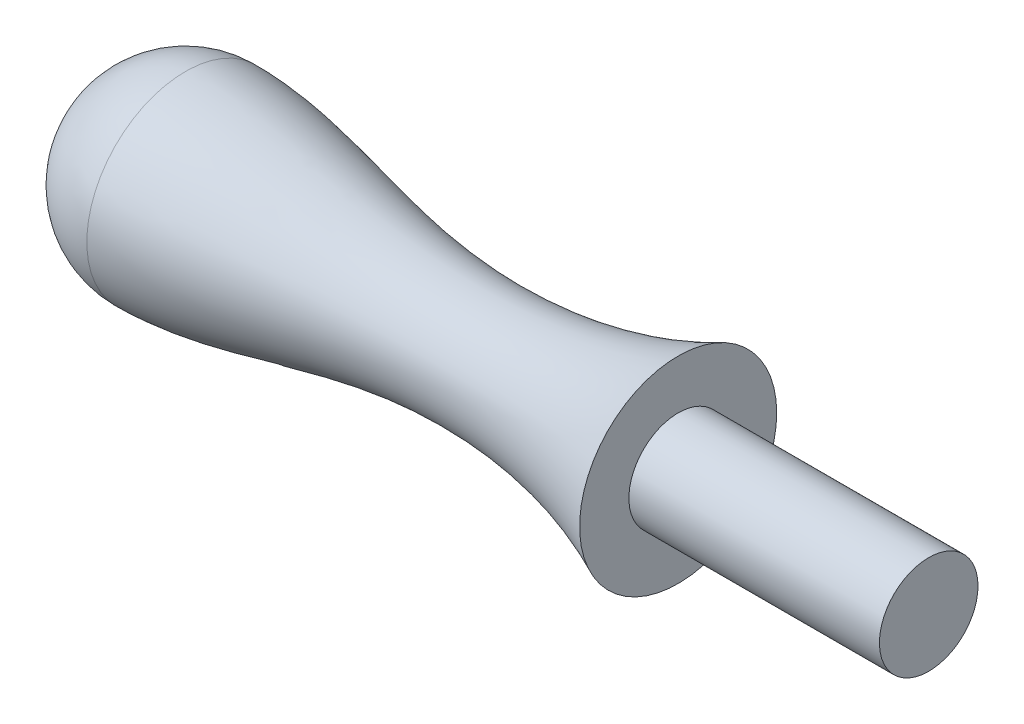
ISO-10303-21;
HEADER;
FILE_DESCRIPTION(('STEP AP214'),'2;1');
FILE_NAME('part.step','',(''),(''),'','','');
FILE_SCHEMA(('AUTOMOTIVE_DESIGN { 1 0 10303 214 1 1 1 1 }'));
ENDSEC;
DATA;
#1=APPLICATION_CONTEXT('core data for automotive mechanical design processes');
#2=APPLICATION_PROTOCOL_DEFINITION('international standard','automotive_design',2000,#1);
#3=PRODUCT_CONTEXT('',#1,'mechanical');
#4=PRODUCT('Part','Part','',(#3));
#5=PRODUCT_RELATED_PRODUCT_CATEGORY('part','',(#4));
#6=PRODUCT_DEFINITION_FORMATION('','',#4);
#7=PRODUCT_DEFINITION_CONTEXT('part definition',#1,'design');
#8=PRODUCT_DEFINITION('design','',#6,#7);
#9=PRODUCT_DEFINITION_SHAPE('','',#8);
#10=(LENGTH_UNIT() NAMED_UNIT(*) SI_UNIT(.MILLI.,.METRE.));
#11=(NAMED_UNIT(*) PLANE_ANGLE_UNIT() SI_UNIT($,.RADIAN.));
#12=(NAMED_UNIT(*) SI_UNIT($,.STERADIAN.) SOLID_ANGLE_UNIT());
#13=UNCERTAINTY_MEASURE_WITH_UNIT(LENGTH_MEASURE(1.E-05),#10,'distance_accuracy_value','');
#14=(GEOMETRIC_REPRESENTATION_CONTEXT(3) GLOBAL_UNCERTAINTY_ASSIGNED_CONTEXT((#13)) GLOBAL_UNIT_ASSIGNED_CONTEXT((#10,
#11,#12)) REPRESENTATION_CONTEXT('',''));
#15=CARTESIAN_POINT('',(0.,0.,0.));
#16=DIRECTION('',(0.,0.,1.));
#17=DIRECTION('',(1.,0.,0.));
#18=AXIS2_PLACEMENT_3D('',#15,#16,#17);
#19=CARTESIAN_POINT('',(0.,0.,-6.35));
#20=CARTESIAN_POINT('',(-5.75017196584729,0.,-3.66305123080805));
#21=CARTESIAN_POINT('',(-16.8937209939469,0.,-2.7635946879617));
#22=CARTESIAN_POINT('',(-27.1705162406024,0.,-6.34999999999999));
#23=CARTESIAN_POINT('',(-31.75,0.,-6.35));
#24=B_SPLINE_CURVE_WITH_KNOTS('',3,(#19,#20,#21,#22,#23),.UNSPECIFIED.,.F.,.F.,(4,1,4),(0.,
0.579529835983861,1.),.UNSPECIFIED.);
#25=CARTESIAN_POINT('',(0.,0.,0.));
#26=DIRECTION('',(1.,0.,0.));
#27=AXIS1_PLACEMENT('',#25,#26);
#28=SURFACE_OF_REVOLUTION('',#24,#27);
#29=CARTESIAN_POINT('',(-31.75,0.,0.));
#30=DIRECTION('',(1.,0.,0.));
#31=DIRECTION('',(0.,0.,-1.));
#32=AXIS2_PLACEMENT_3D('',#29,#30,#31);
#33=CIRCLE('',#32,6.35);
#34=CARTESIAN_POINT('',(-31.75,0.,-6.35));
#35=VERTEX_POINT('',#34);
#36=EDGE_CURVE('E36',#35,#35,#33,.T.);
#37=ORIENTED_EDGE('',*,*,#36,.T.);
#38=EDGE_LOOP('',(#37));
#39=FACE_BOUND('',#38,.T.);
#40=CARTESIAN_POINT('',(0.,0.,0.));
#41=DIRECTION('',(1.,0.,0.));
#42=DIRECTION('',(0.,0.,-1.));
#43=AXIS2_PLACEMENT_3D('',#40,#41,#42);
#44=CIRCLE('',#43,6.35);
#45=CARTESIAN_POINT('',(0.,0.,-6.35));
#46=VERTEX_POINT('',#45);
#47=EDGE_CURVE('E44',#46,#46,#44,.T.);
#48=ORIENTED_EDGE('',*,*,#47,.F.);
#49=EDGE_LOOP('',(#48));
#50=FACE_BOUND('',#49,.T.);
#51=ADVANCED_FACE('F32',(#39,#50),#28,.F.);
#52=CARTESIAN_POINT('',(-31.75,0.,0.));
#53=DIRECTION('',(1.,0.,0.));
#54=DIRECTION('',(0.,0.,-1.));
#55=AXIS2_PLACEMENT_3D('',#52,#53,#54);
#56=SPHERICAL_SURFACE('',#55,6.35);
#57=ORIENTED_EDGE('',*,*,#36,.F.);
#58=EDGE_LOOP('',(#57));
#59=FACE_BOUND('',#58,.T.);
#60=ADVANCED_FACE('F70',(#59),#56,.T.);
#61=CARTESIAN_POINT('',(0.,0.,-6.35));
#62=DIRECTION('',(1.,0.,0.));
#63=DIRECTION('',(0.,0.,-1.));
#64=AXIS2_PLACEMENT_3D('',#61,#62,#63);
#65=PLANE('',#64);
#66=CARTESIAN_POINT('',(0.,0.,0.));
#67=DIRECTION('',(1.,0.,0.));
#68=DIRECTION('',(0.,0.,-1.));
#69=AXIS2_PLACEMENT_3D('',#66,#67,#68);
#70=CIRCLE('',#69,3.175);
#71=CARTESIAN_POINT('',(0.,0.,-3.175));
#72=VERTEX_POINT('',#71);
#73=EDGE_CURVE('E10',#72,#72,#70,.T.);
#74=ORIENTED_EDGE('',*,*,#73,.F.);
#75=EDGE_LOOP('',(#74));
#76=FACE_BOUND('',#75,.T.);
#77=ORIENTED_EDGE('',*,*,#47,.T.);
#78=EDGE_LOOP('',(#77));
#79=FACE_BOUND('',#78,.T.);
#80=ADVANCED_FACE('F63',(#76,#79),#65,.T.);
#81=CARTESIAN_POINT('',(16.1436027275829,0.,0.));
#82=DIRECTION('',(-1.,0.,0.));
#83=DIRECTION('',(0.,0.,1.));
#84=AXIS2_PLACEMENT_3D('',#81,#82,#83);
#85=CYLINDRICAL_SURFACE('',#84,3.175);
#86=CARTESIAN_POINT('',(16.1436027275829,0.,0.));
#87=DIRECTION('',(1.,0.,0.));
#88=DIRECTION('',(0.,0.,-1.));
#89=AXIS2_PLACEMENT_3D('',#86,#87,#88);
#90=CIRCLE('',#89,3.175);
#91=CARTESIAN_POINT('',(16.1436027275829,0.,-3.175));
#92=VERTEX_POINT('',#91);
#93=EDGE_CURVE('E46',#92,#92,#90,.T.);
#94=ORIENTED_EDGE('',*,*,#93,.F.);
#95=EDGE_LOOP('',(#94));
#96=FACE_BOUND('',#95,.T.);
#97=ORIENTED_EDGE('',*,*,#73,.T.);
#98=EDGE_LOOP('',(#97));
#99=FACE_BOUND('',#98,.T.);
#100=ADVANCED_FACE('F61',(#96,#99),#85,.T.);
#101=CARTESIAN_POINT('',(16.1436027275829,0.,0.));
#102=DIRECTION('',(1.,0.,0.));
#103=DIRECTION('',(0.,0.,-1.));
#104=AXIS2_PLACEMENT_3D('',#101,#102,#103);
#105=PLANE('',#104);
#106=ORIENTED_EDGE('',*,*,#93,.T.);
#107=EDGE_LOOP('',(#106));
#108=FACE_BOUND('',#107,.T.);
#109=ADVANCED_FACE('F59',(#108),#105,.T.);
#110=CLOSED_SHELL('',(#51,#60,#80,#100,#109));
#111=MANIFOLD_SOLID_BREP('B2',#110);
#112=ADVANCED_BREP_SHAPE_REPRESENTATION('',(#18,#111),#14);
#113=SHAPE_DEFINITION_REPRESENTATION(#9,#112);
ENDSEC;
END-ISO-10303-21;
